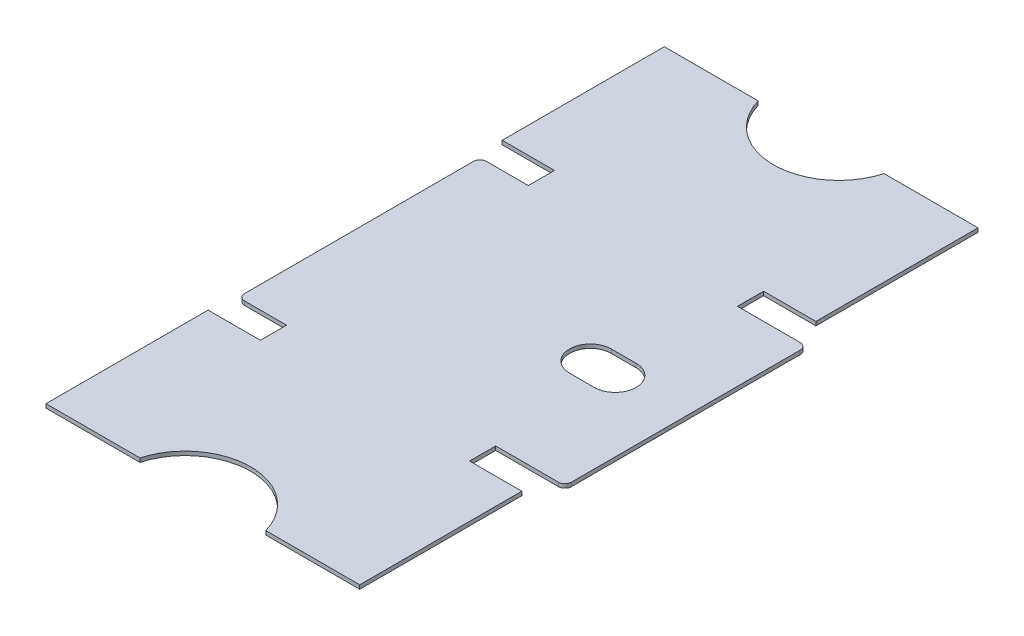
ISO-10303-21;
HEADER;
FILE_DESCRIPTION(('STEP AP214'),'2;1');
FILE_NAME('part.step','',(''),(''),'','','');
FILE_SCHEMA(('AUTOMOTIVE_DESIGN { 1 0 10303 214 1 1 1 1 }'));
ENDSEC;
DATA;
#1=APPLICATION_CONTEXT('core data for automotive mechanical design processes');
#2=APPLICATION_PROTOCOL_DEFINITION('international standard','automotive_design',2000,#1);
#3=PRODUCT_CONTEXT('',#1,'mechanical');
#4=PRODUCT('Part','Part','',(#3));
#5=PRODUCT_RELATED_PRODUCT_CATEGORY('part','',(#4));
#6=PRODUCT_DEFINITION_FORMATION('','',#4);
#7=PRODUCT_DEFINITION_CONTEXT('part definition',#1,'design');
#8=PRODUCT_DEFINITION('design','',#6,#7);
#9=PRODUCT_DEFINITION_SHAPE('','',#8);
#10=(LENGTH_UNIT() NAMED_UNIT(*) SI_UNIT(.MILLI.,.METRE.));
#11=(NAMED_UNIT(*) PLANE_ANGLE_UNIT() SI_UNIT($,.RADIAN.));
#12=(NAMED_UNIT(*) SI_UNIT($,.STERADIAN.) SOLID_ANGLE_UNIT());
#13=UNCERTAINTY_MEASURE_WITH_UNIT(LENGTH_MEASURE(1.E-05),#10,'distance_accuracy_value','');
#14=(GEOMETRIC_REPRESENTATION_CONTEXT(3) GLOBAL_UNCERTAINTY_ASSIGNED_CONTEXT((#13)) GLOBAL_UNIT_ASSIGNED_CONTEXT((#10,
#11,#12)) REPRESENTATION_CONTEXT('',''));
#15=CARTESIAN_POINT('',(0.,0.,0.));
#16=DIRECTION('',(0.,0.,1.));
#17=DIRECTION('',(1.,0.,0.));
#18=AXIS2_PLACEMENT_3D('',#15,#16,#17);
#19=CARTESIAN_POINT('',(-23.4045410586217,0.3,-30.1001557545187));
#20=DIRECTION('',(0.,1.,0.));
#21=DIRECTION('',(0.,0.,1.));
#22=AXIS2_PLACEMENT_3D('',#19,#20,#21);
#23=PLANE('',#22);
#24=DIRECTION('',(1.,0.,0.));
#25=VECTOR('',#24,1.);
#26=CARTESIAN_POINT('',(-15.4045410586217,0.3,-16.3501557545187));
#27=LINE('',#26,#25);
#28=CARTESIAN_POINT('',(-15.4045410586217,0.3,-16.3501557545187));
#29=VERTEX_POINT('',#28);
#30=CARTESIAN_POINT('',(-11.4045410586217,0.3,-16.3501557545187));
#31=VERTEX_POINT('',#30);
#32=EDGE_CURVE('E279',#29,#31,#27,.T.);
#33=ORIENTED_EDGE('',*,*,#32,.T.);
#34=DIRECTION('',(0.,0.,-1.));
#35=VECTOR('',#34,1.);
#36=CARTESIAN_POINT('',(-11.4045410586217,0.3,-16.3501557545187));
#37=LINE('',#36,#35);
#38=CARTESIAN_POINT('',(-11.4045410586217,0.3,-28.7501557545188));
#39=VERTEX_POINT('',#38);
#40=EDGE_CURVE('E282',#31,#39,#37,.T.);
#41=ORIENTED_EDGE('',*,*,#40,.T.);
#42=DIRECTION('',(-1.,0.,0.));
#43=VECTOR('',#42,1.);
#44=CARTESIAN_POINT('',(-11.4045410586217,0.3,-28.7501557545188));
#45=LINE('',#44,#43);
#46=CARTESIAN_POINT('',(-18.5902394477959,0.3,-28.7501557545188));
#47=VERTEX_POINT('',#46);
#48=EDGE_CURVE('E285',#39,#47,#45,.T.);
#49=ORIENTED_EDGE('',*,*,#48,.T.);
#50=CARTESIAN_POINT('',(-23.4045410586217,0.3,-30.1001557545187));
#51=DIRECTION('',(0.,-1.,0.));
#52=DIRECTION('',(0.,0.,1.));
#53=AXIS2_PLACEMENT_3D('',#50,#51,#52);
#54=CIRCLE('',#53,5.);
#55=CARTESIAN_POINT('',(-28.2188426694476,0.3,-28.7501557545188));
#56=VERTEX_POINT('',#55);
#57=EDGE_CURVE('E287',#47,#56,#54,.T.);
#58=ORIENTED_EDGE('',*,*,#57,.T.);
#59=DIRECTION('',(-1.,0.,0.));
#60=VECTOR('',#59,1.);
#61=CARTESIAN_POINT('',(-28.2188426694476,0.3,-28.7501557545188));
#62=LINE('',#61,#60);
#63=CARTESIAN_POINT('',(-35.4045410586217,0.3,-28.7501557545188));
#64=VERTEX_POINT('',#63);
#65=EDGE_CURVE('E289',#56,#64,#62,.T.);
#66=ORIENTED_EDGE('',*,*,#65,.T.);
#67=DIRECTION('',(0.,0.,1.));
#68=VECTOR('',#67,1.);
#69=CARTESIAN_POINT('',(-35.4045410586217,0.3,-28.7501557545188));
#70=LINE('',#69,#68);
#71=CARTESIAN_POINT('',(-35.4045410586217,0.3,-16.3501557545187));
#72=VERTEX_POINT('',#71);
#73=EDGE_CURVE('E291',#64,#72,#70,.T.);
#74=ORIENTED_EDGE('',*,*,#73,.T.);
#75=DIRECTION('',(1.,0.,0.));
#76=VECTOR('',#75,1.);
#77=CARTESIAN_POINT('',(-35.4045410586217,0.3,-16.3501557545187));
#78=LINE('',#77,#76);
#79=CARTESIAN_POINT('',(-31.4045410586218,0.3,-16.3501557545187));
#80=VERTEX_POINT('',#79);
#81=EDGE_CURVE('E293',#72,#80,#78,.T.);
#82=ORIENTED_EDGE('',*,*,#81,.T.);
#83=DIRECTION('',(0.,0.,1.));
#84=VECTOR('',#83,1.);
#85=CARTESIAN_POINT('',(-31.4045410586218,0.3,-16.3501557545187));
#86=LINE('',#85,#84);
#87=CARTESIAN_POINT('',(-31.4045410586218,0.3,-14.3501557545187));
#88=VERTEX_POINT('',#87);
#89=EDGE_CURVE('E295',#80,#88,#86,.T.);
#90=ORIENTED_EDGE('',*,*,#89,.T.);
#91=DIRECTION('',(-1.,0.,0.));
#92=VECTOR('',#91,1.);
#93=CARTESIAN_POINT('',(-31.4045410586218,0.3,-14.3501557545187));
#94=LINE('',#93,#92);
#95=CARTESIAN_POINT('',(-34.6045410586218,0.3,-14.3501557545187));
#96=VERTEX_POINT('',#95);
#97=EDGE_CURVE('E297',#88,#96,#94,.T.);
#98=ORIENTED_EDGE('',*,*,#97,.T.);
#99=CARTESIAN_POINT('',(-34.6045410586217,0.3,-13.8501557545187));
#100=DIRECTION('',(0.,1.,0.));
#101=DIRECTION('',(0.,0.,1.));
#102=AXIS2_PLACEMENT_3D('',#99,#100,#101);
#103=CIRCLE('',#102,0.5);
#104=CARTESIAN_POINT('',(-35.1045410586217,0.3,-13.8501557545187));
#105=VERTEX_POINT('',#104);
#106=EDGE_CURVE('E299',#96,#105,#103,.T.);
#107=ORIENTED_EDGE('',*,*,#106,.T.);
#108=DIRECTION('',(0.,0.,1.));
#109=VECTOR('',#108,1.);
#110=CARTESIAN_POINT('',(-35.1045410586217,0.3,-13.8501557545187));
#111=LINE('',#110,#109);
#112=CARTESIAN_POINT('',(-35.1045410586217,0.3,3.64984424548134));
#113=VERTEX_POINT('',#112);
#114=EDGE_CURVE('E301',#105,#113,#111,.T.);
#115=ORIENTED_EDGE('',*,*,#114,.T.);
#116=CARTESIAN_POINT('',(-34.6045410586217,0.3,3.64984424548133));
#117=DIRECTION('',(0.,1.,0.));
#118=DIRECTION('',(0.,0.,1.));
#119=AXIS2_PLACEMENT_3D('',#116,#117,#118);
#120=CIRCLE('',#119,0.5);
#121=CARTESIAN_POINT('',(-34.6045410586217,0.3,4.14984424548133));
#122=VERTEX_POINT('',#121);
#123=EDGE_CURVE('E303',#113,#122,#120,.T.);
#124=ORIENTED_EDGE('',*,*,#123,.T.);
#125=DIRECTION('',(1.,0.,0.));
#126=VECTOR('',#125,1.);
#127=CARTESIAN_POINT('',(-34.6045410586217,0.3,4.14984424548133));
#128=LINE('',#127,#126);
#129=CARTESIAN_POINT('',(-31.4045410586217,0.3,4.14984424548133));
#130=VERTEX_POINT('',#129);
#131=EDGE_CURVE('E305',#122,#130,#128,.T.);
#132=ORIENTED_EDGE('',*,*,#131,.T.);
#133=DIRECTION('',(0.,0.,1.));
#134=VECTOR('',#133,1.);
#135=CARTESIAN_POINT('',(-31.4045410586217,0.3,4.14984424548133));
#136=LINE('',#135,#134);
#137=CARTESIAN_POINT('',(-31.4045410586218,0.3,6.14984424548133));
#138=VERTEX_POINT('',#137);
#139=EDGE_CURVE('E307',#130,#138,#136,.T.);
#140=ORIENTED_EDGE('',*,*,#139,.T.);
#141=DIRECTION('',(-1.,0.,0.));
#142=VECTOR('',#141,1.);
#143=CARTESIAN_POINT('',(-31.4045410586218,0.3,6.14984424548133));
#144=LINE('',#143,#142);
#145=CARTESIAN_POINT('',(-35.4045410586217,0.3,6.14984424548133));
#146=VERTEX_POINT('',#145);
#147=EDGE_CURVE('E309',#138,#146,#144,.T.);
#148=ORIENTED_EDGE('',*,*,#147,.T.);
#149=DIRECTION('',(0.,0.,1.));
#150=VECTOR('',#149,1.);
#151=CARTESIAN_POINT('',(-35.4045410586217,0.3,6.14984424548133));
#152=LINE('',#151,#150);
#153=CARTESIAN_POINT('',(-35.4045410586217,0.3,18.5498442454815));
#154=VERTEX_POINT('',#153);
#155=EDGE_CURVE('E311',#146,#154,#152,.T.);
#156=ORIENTED_EDGE('',*,*,#155,.T.);
#157=DIRECTION('',(1.,0.,0.));
#158=VECTOR('',#157,1.);
#159=CARTESIAN_POINT('',(-35.4045410586217,0.3,18.5498442454815));
#160=LINE('',#159,#158);
#161=CARTESIAN_POINT('',(-28.2188426694476,0.3,18.5498442454815));
#162=VERTEX_POINT('',#161);
#163=EDGE_CURVE('E313',#154,#162,#160,.T.);
#164=ORIENTED_EDGE('',*,*,#163,.T.);
#165=CARTESIAN_POINT('',(-23.4045410586217,0.3,19.8998442454812));
#166=DIRECTION('',(0.,-1.,0.));
#167=DIRECTION('',(0.,0.,1.));
#168=AXIS2_PLACEMENT_3D('',#165,#166,#167);
#169=CIRCLE('',#168,5.);
#170=CARTESIAN_POINT('',(-18.5902394477958,0.3,18.5498442454815));
#171=VERTEX_POINT('',#170);
#172=EDGE_CURVE('E315',#162,#171,#169,.T.);
#173=ORIENTED_EDGE('',*,*,#172,.T.);
#174=DIRECTION('',(1.,0.,0.));
#175=VECTOR('',#174,1.);
#176=CARTESIAN_POINT('',(-18.5902394477958,0.3,18.5498442454815));
#177=LINE('',#176,#175);
#178=CARTESIAN_POINT('',(-11.4045410586217,0.3,18.5498442454815));
#179=VERTEX_POINT('',#178);
#180=EDGE_CURVE('E317',#171,#179,#177,.T.);
#181=ORIENTED_EDGE('',*,*,#180,.T.);
#182=DIRECTION('',(0.,0.,-1.));
#183=VECTOR('',#182,1.);
#184=CARTESIAN_POINT('',(-11.4045410586217,0.3,18.5498442454815));
#185=LINE('',#184,#183);
#186=CARTESIAN_POINT('',(-11.4045410586217,0.3,6.14984424548133));
#187=VERTEX_POINT('',#186);
#188=EDGE_CURVE('E319',#179,#187,#185,.T.);
#189=ORIENTED_EDGE('',*,*,#188,.T.);
#190=DIRECTION('',(-1.,0.,0.));
#191=VECTOR('',#190,1.);
#192=CARTESIAN_POINT('',(-11.4045410586217,0.3,6.14984424548133));
#193=LINE('',#192,#191);
#194=CARTESIAN_POINT('',(-15.4045410586217,0.3,6.14984424548133));
#195=VERTEX_POINT('',#194);
#196=EDGE_CURVE('E321',#187,#195,#193,.T.);
#197=ORIENTED_EDGE('',*,*,#196,.T.);
#198=DIRECTION('',(0.,0.,-1.));
#199=VECTOR('',#198,1.);
#200=CARTESIAN_POINT('',(-15.4045410586217,0.3,6.14984424548133));
#201=LINE('',#200,#199);
#202=CARTESIAN_POINT('',(-15.4045410586217,0.3,4.14984424548133));
#203=VERTEX_POINT('',#202);
#204=EDGE_CURVE('E323',#195,#203,#201,.T.);
#205=ORIENTED_EDGE('',*,*,#204,.T.);
#206=DIRECTION('',(1.,0.,0.));
#207=VECTOR('',#206,1.);
#208=CARTESIAN_POINT('',(-15.4045410586217,0.3,4.14984424548133));
#209=LINE('',#208,#207);
#210=CARTESIAN_POINT('',(-10.6045410586217,0.3,4.14984424548132));
#211=VERTEX_POINT('',#210);
#212=EDGE_CURVE('E325',#203,#211,#209,.T.);
#213=ORIENTED_EDGE('',*,*,#212,.T.);
#214=CARTESIAN_POINT('',(-10.6045410586217,0.3,3.64984424548133));
#215=DIRECTION('',(0.,1.,0.));
#216=DIRECTION('',(0.,0.,1.));
#217=AXIS2_PLACEMENT_3D('',#214,#215,#216);
#218=CIRCLE('',#217,0.499999999999999);
#219=CARTESIAN_POINT('',(-10.1045410586217,0.3,3.64984424548133));
#220=VERTEX_POINT('',#219);
#221=EDGE_CURVE('E327',#211,#220,#218,.T.);
#222=ORIENTED_EDGE('',*,*,#221,.T.);
#223=DIRECTION('',(0.,0.,-1.));
#224=VECTOR('',#223,1.);
#225=CARTESIAN_POINT('',(-10.1045410586217,0.3,3.64984424548133));
#226=LINE('',#225,#224);
#227=CARTESIAN_POINT('',(-10.1045410586217,0.3,-13.8501557545187));
#228=VERTEX_POINT('',#227);
#229=EDGE_CURVE('E329',#220,#228,#226,.T.);
#230=ORIENTED_EDGE('',*,*,#229,.T.);
#231=CARTESIAN_POINT('',(-10.6045410586217,0.3,-13.8501557545187));
#232=DIRECTION('',(0.,1.,0.));
#233=DIRECTION('',(0.,0.,1.));
#234=AXIS2_PLACEMENT_3D('',#231,#232,#233);
#235=CIRCLE('',#234,0.499999999999997);
#236=CARTESIAN_POINT('',(-10.6045410586218,0.3,-14.3501557545187));
#237=VERTEX_POINT('',#236);
#238=EDGE_CURVE('E331',#228,#237,#235,.T.);
#239=ORIENTED_EDGE('',*,*,#238,.T.);
#240=DIRECTION('',(-1.,0.,0.));
#241=VECTOR('',#240,1.);
#242=CARTESIAN_POINT('',(-10.6045410586218,0.3,-14.3501557545187));
#243=LINE('',#242,#241);
#244=CARTESIAN_POINT('',(-15.4045410586217,0.3,-14.3501557545187));
#245=VERTEX_POINT('',#244);
#246=EDGE_CURVE('E333',#237,#245,#243,.T.);
#247=ORIENTED_EDGE('',*,*,#246,.T.);
#248=DIRECTION('',(0.,0.,-1.));
#249=VECTOR('',#248,1.);
#250=CARTESIAN_POINT('',(-15.4045410586217,0.3,-14.3501557545187));
#251=LINE('',#250,#249);
#252=EDGE_CURVE('E335',#245,#29,#251,.T.);
#253=ORIENTED_EDGE('',*,*,#252,.T.);
#254=EDGE_LOOP('',(#33,#41,#49,#58,#66,#74,#82,#90,#98,#107,#115,#124,#132,#140,#148,#156,#164,
#173,#181,#189,#197,#205,#213,#222,#230,#239,#247,#253));
#255=FACE_BOUND('',#254,.T.);
#256=DIRECTION('',(1.,0.,0.));
#257=VECTOR('',#256,1.);
#258=CARTESIAN_POINT('',(-17.4045410586217,0.3,-3.50015575451867));
#259=LINE('',#258,#257);
#260=CARTESIAN_POINT('',(-17.4045410586217,0.3,-3.50015575451867));
#261=VERTEX_POINT('',#260);
#262=CARTESIAN_POINT('',(-15.5045410586217,0.3,-3.50015575451867));
#263=VERTEX_POINT('',#262);
#264=EDGE_CURVE('E251',#261,#263,#259,.T.);
#265=ORIENTED_EDGE('',*,*,#264,.F.);
#266=CARTESIAN_POINT('',(-17.4045410586217,0.3,-5.10015575451868));
#267=DIRECTION('',(0.,1.,0.));
#268=DIRECTION('',(0.,0.,1.));
#269=AXIS2_PLACEMENT_3D('',#266,#267,#268);
#270=CIRCLE('',#269,1.6);
#271=CARTESIAN_POINT('',(-17.4045410586217,0.3,-6.70015575451868));
#272=VERTEX_POINT('',#271);
#273=EDGE_CURVE('E243',#272,#261,#270,.T.);
#274=ORIENTED_EDGE('',*,*,#273,.F.);
#275=DIRECTION('',(-1.,0.,0.));
#276=VECTOR('',#275,1.);
#277=CARTESIAN_POINT('',(-17.4045410586217,0.3,-6.70015575451868));
#278=LINE('',#277,#276);
#279=CARTESIAN_POINT('',(-15.5045410586217,0.3,-6.70015575451868));
#280=VERTEX_POINT('',#279);
#281=EDGE_CURVE('E265',#280,#272,#278,.T.);
#282=ORIENTED_EDGE('',*,*,#281,.F.);
#283=CARTESIAN_POINT('',(-15.5045410586217,0.3,-5.10015575451868));
#284=DIRECTION('',(0.,1.,0.));
#285=DIRECTION('',(0.,0.,1.));
#286=AXIS2_PLACEMENT_3D('',#283,#284,#285);
#287=CIRCLE('',#286,1.6);
#288=EDGE_CURVE('E263',#263,#280,#287,.T.);
#289=ORIENTED_EDGE('',*,*,#288,.F.);
#290=EDGE_LOOP('',(#265,#274,#282,#289));
#291=FACE_BOUND('',#290,.T.);
#292=ADVANCED_FACE('F34',(#255,#291),#23,.T.);
#293=CARTESIAN_POINT('',(-23.4045410586217,0.,-30.1001557545187));
#294=DIRECTION('',(0.,1.,0.));
#295=DIRECTION('',(0.,0.,1.));
#296=AXIS2_PLACEMENT_3D('',#293,#294,#295);
#297=PLANE('',#296);
#298=DIRECTION('',(1.,0.,0.));
#299=VECTOR('',#298,1.);
#300=CARTESIAN_POINT('',(-15.4045410586217,0.,-16.3501557545187));
#301=LINE('',#300,#299);
#302=CARTESIAN_POINT('',(-15.4045410586217,0.,-16.3501557545187));
#303=VERTEX_POINT('',#302);
#304=CARTESIAN_POINT('',(-11.4045410586217,0.,-16.3501557545187));
#305=VERTEX_POINT('',#304);
#306=EDGE_CURVE('E259',#303,#305,#301,.T.);
#307=ORIENTED_EDGE('',*,*,#306,.F.);
#308=DIRECTION('',(0.,0.,-1.));
#309=VECTOR('',#308,1.);
#310=CARTESIAN_POINT('',(-15.4045410586217,0.,-14.3501557545187));
#311=LINE('',#310,#309);
#312=CARTESIAN_POINT('',(-15.4045410586217,0.,-14.3501557545187));
#313=VERTEX_POINT('',#312);
#314=EDGE_CURVE('E283',#313,#303,#311,.T.);
#315=ORIENTED_EDGE('',*,*,#314,.F.);
#316=DIRECTION('',(-1.,0.,0.));
#317=VECTOR('',#316,1.);
#318=CARTESIAN_POINT('',(-10.6045410586218,0.,-14.3501557545187));
#319=LINE('',#318,#317);
#320=CARTESIAN_POINT('',(-10.6045410586218,0.,-14.3501557545187));
#321=VERTEX_POINT('',#320);
#322=EDGE_CURVE('E390',#321,#313,#319,.T.);
#323=ORIENTED_EDGE('',*,*,#322,.F.);
#324=CARTESIAN_POINT('',(-10.6045410586217,0.,-13.8501557545187));
#325=DIRECTION('',(0.,1.,0.));
#326=DIRECTION('',(0.,0.,1.));
#327=AXIS2_PLACEMENT_3D('',#324,#325,#326);
#328=CIRCLE('',#327,0.499999999999997);
#329=CARTESIAN_POINT('',(-10.1045410586217,0.,-13.8501557545187));
#330=VERTEX_POINT('',#329);
#331=EDGE_CURVE('E388',#330,#321,#328,.T.);
#332=ORIENTED_EDGE('',*,*,#331,.F.);
#333=DIRECTION('',(0.,0.,-1.));
#334=VECTOR('',#333,1.);
#335=CARTESIAN_POINT('',(-10.1045410586217,0.,3.64984424548133));
#336=LINE('',#335,#334);
#337=CARTESIAN_POINT('',(-10.1045410586217,0.,3.64984424548133));
#338=VERTEX_POINT('',#337);
#339=EDGE_CURVE('E386',#338,#330,#336,.T.);
#340=ORIENTED_EDGE('',*,*,#339,.F.);
#341=CARTESIAN_POINT('',(-10.6045410586217,0.,3.64984424548133));
#342=DIRECTION('',(0.,1.,0.));
#343=DIRECTION('',(0.,0.,1.));
#344=AXIS2_PLACEMENT_3D('',#341,#342,#343);
#345=CIRCLE('',#344,0.499999999999999);
#346=CARTESIAN_POINT('',(-10.6045410586217,0.,4.14984424548132));
#347=VERTEX_POINT('',#346);
#348=EDGE_CURVE('E384',#347,#338,#345,.T.);
#349=ORIENTED_EDGE('',*,*,#348,.F.);
#350=DIRECTION('',(1.,0.,0.));
#351=VECTOR('',#350,1.);
#352=CARTESIAN_POINT('',(-15.4045410586217,0.,4.14984424548133));
#353=LINE('',#352,#351);
#354=CARTESIAN_POINT('',(-15.4045410586217,0.,4.14984424548133));
#355=VERTEX_POINT('',#354);
#356=EDGE_CURVE('E382',#355,#347,#353,.T.);
#357=ORIENTED_EDGE('',*,*,#356,.F.);
#358=DIRECTION('',(0.,0.,-1.));
#359=VECTOR('',#358,1.);
#360=CARTESIAN_POINT('',(-15.4045410586217,0.,6.14984424548133));
#361=LINE('',#360,#359);
#362=CARTESIAN_POINT('',(-15.4045410586217,0.,6.14984424548133));
#363=VERTEX_POINT('',#362);
#364=EDGE_CURVE('E380',#363,#355,#361,.T.);
#365=ORIENTED_EDGE('',*,*,#364,.F.);
#366=DIRECTION('',(-1.,0.,0.));
#367=VECTOR('',#366,1.);
#368=CARTESIAN_POINT('',(-11.4045410586217,0.,6.14984424548133));
#369=LINE('',#368,#367);
#370=CARTESIAN_POINT('',(-11.4045410586217,0.,6.14984424548133));
#371=VERTEX_POINT('',#370);
#372=EDGE_CURVE('E378',#371,#363,#369,.T.);
#373=ORIENTED_EDGE('',*,*,#372,.F.);
#374=DIRECTION('',(0.,0.,-1.));
#375=VECTOR('',#374,1.);
#376=CARTESIAN_POINT('',(-11.4045410586217,0.,18.5498442454815));
#377=LINE('',#376,#375);
#378=CARTESIAN_POINT('',(-11.4045410586217,0.,18.5498442454815));
#379=VERTEX_POINT('',#378);
#380=EDGE_CURVE('E376',#379,#371,#377,.T.);
#381=ORIENTED_EDGE('',*,*,#380,.F.);
#382=DIRECTION('',(1.,0.,0.));
#383=VECTOR('',#382,1.);
#384=CARTESIAN_POINT('',(-18.5902394477958,0.,18.5498442454815));
#385=LINE('',#384,#383);
#386=CARTESIAN_POINT('',(-18.5902394477958,0.,18.5498442454815));
#387=VERTEX_POINT('',#386);
#388=EDGE_CURVE('E374',#387,#379,#385,.T.);
#389=ORIENTED_EDGE('',*,*,#388,.F.);
#390=CARTESIAN_POINT('',(-23.4045410586217,0.,19.8998442454812));
#391=DIRECTION('',(0.,-1.,0.));
#392=DIRECTION('',(0.,0.,1.));
#393=AXIS2_PLACEMENT_3D('',#390,#391,#392);
#394=CIRCLE('',#393,5.);
#395=CARTESIAN_POINT('',(-28.2188426694476,0.,18.5498442454815));
#396=VERTEX_POINT('',#395);
#397=EDGE_CURVE('E372',#396,#387,#394,.T.);
#398=ORIENTED_EDGE('',*,*,#397,.F.);
#399=DIRECTION('',(1.,0.,0.));
#400=VECTOR('',#399,1.);
#401=CARTESIAN_POINT('',(-35.4045410586217,0.,18.5498442454815));
#402=LINE('',#401,#400);
#403=CARTESIAN_POINT('',(-35.4045410586217,0.,18.5498442454815));
#404=VERTEX_POINT('',#403);
#405=EDGE_CURVE('E370',#404,#396,#402,.T.);
#406=ORIENTED_EDGE('',*,*,#405,.F.);
#407=DIRECTION('',(0.,0.,1.));
#408=VECTOR('',#407,1.);
#409=CARTESIAN_POINT('',(-35.4045410586217,0.,6.14984424548133));
#410=LINE('',#409,#408);
#411=CARTESIAN_POINT('',(-35.4045410586217,0.,6.14984424548133));
#412=VERTEX_POINT('',#411);
#413=EDGE_CURVE('E368',#412,#404,#410,.T.);
#414=ORIENTED_EDGE('',*,*,#413,.F.);
#415=DIRECTION('',(-1.,0.,0.));
#416=VECTOR('',#415,1.);
#417=CARTESIAN_POINT('',(-31.4045410586218,0.,6.14984424548133));
#418=LINE('',#417,#416);
#419=CARTESIAN_POINT('',(-31.4045410586218,0.,6.14984424548133));
#420=VERTEX_POINT('',#419);
#421=EDGE_CURVE('E366',#420,#412,#418,.T.);
#422=ORIENTED_EDGE('',*,*,#421,.F.);
#423=DIRECTION('',(0.,0.,1.));
#424=VECTOR('',#423,1.);
#425=CARTESIAN_POINT('',(-31.4045410586217,0.,4.14984424548133));
#426=LINE('',#425,#424);
#427=CARTESIAN_POINT('',(-31.4045410586217,0.,4.14984424548133));
#428=VERTEX_POINT('',#427);
#429=EDGE_CURVE('E364',#428,#420,#426,.T.);
#430=ORIENTED_EDGE('',*,*,#429,.F.);
#431=DIRECTION('',(1.,0.,0.));
#432=VECTOR('',#431,1.);
#433=CARTESIAN_POINT('',(-34.6045410586217,0.,4.14984424548133));
#434=LINE('',#433,#432);
#435=CARTESIAN_POINT('',(-34.6045410586217,0.,4.14984424548133));
#436=VERTEX_POINT('',#435);
#437=EDGE_CURVE('E362',#436,#428,#434,.T.);
#438=ORIENTED_EDGE('',*,*,#437,.F.);
#439=CARTESIAN_POINT('',(-34.6045410586217,0.,3.64984424548133));
#440=DIRECTION('',(0.,1.,0.));
#441=DIRECTION('',(0.,0.,1.));
#442=AXIS2_PLACEMENT_3D('',#439,#440,#441);
#443=CIRCLE('',#442,0.5);
#444=CARTESIAN_POINT('',(-35.1045410586217,0.,3.64984424548134));
#445=VERTEX_POINT('',#444);
#446=EDGE_CURVE('E360',#445,#436,#443,.T.);
#447=ORIENTED_EDGE('',*,*,#446,.F.);
#448=DIRECTION('',(0.,0.,1.));
#449=VECTOR('',#448,1.);
#450=CARTESIAN_POINT('',(-35.1045410586217,0.,-13.8501557545187));
#451=LINE('',#450,#449);
#452=CARTESIAN_POINT('',(-35.1045410586217,0.,-13.8501557545187));
#453=VERTEX_POINT('',#452);
#454=EDGE_CURVE('E358',#453,#445,#451,.T.);
#455=ORIENTED_EDGE('',*,*,#454,.F.);
#456=CARTESIAN_POINT('',(-34.6045410586217,0.,-13.8501557545187));
#457=DIRECTION('',(0.,1.,0.));
#458=DIRECTION('',(0.,0.,1.));
#459=AXIS2_PLACEMENT_3D('',#456,#457,#458);
#460=CIRCLE('',#459,0.5);
#461=CARTESIAN_POINT('',(-34.6045410586218,0.,-14.3501557545187));
#462=VERTEX_POINT('',#461);
#463=EDGE_CURVE('E356',#462,#453,#460,.T.);
#464=ORIENTED_EDGE('',*,*,#463,.F.);
#465=DIRECTION('',(-1.,0.,0.));
#466=VECTOR('',#465,1.);
#467=CARTESIAN_POINT('',(-31.4045410586218,0.,-14.3501557545187));
#468=LINE('',#467,#466);
#469=CARTESIAN_POINT('',(-31.4045410586218,0.,-14.3501557545187));
#470=VERTEX_POINT('',#469);
#471=EDGE_CURVE('E354',#470,#462,#468,.T.);
#472=ORIENTED_EDGE('',*,*,#471,.F.);
#473=DIRECTION('',(0.,0.,1.));
#474=VECTOR('',#473,1.);
#475=CARTESIAN_POINT('',(-31.4045410586218,0.,-16.3501557545187));
#476=LINE('',#475,#474);
#477=CARTESIAN_POINT('',(-31.4045410586218,0.,-16.3501557545187));
#478=VERTEX_POINT('',#477);
#479=EDGE_CURVE('E352',#478,#470,#476,.T.);
#480=ORIENTED_EDGE('',*,*,#479,.F.);
#481=DIRECTION('',(1.,0.,0.));
#482=VECTOR('',#481,1.);
#483=CARTESIAN_POINT('',(-35.4045410586217,0.,-16.3501557545187));
#484=LINE('',#483,#482);
#485=CARTESIAN_POINT('',(-35.4045410586217,0.,-16.3501557545187));
#486=VERTEX_POINT('',#485);
#487=EDGE_CURVE('E350',#486,#478,#484,.T.);
#488=ORIENTED_EDGE('',*,*,#487,.F.);
#489=DIRECTION('',(0.,0.,1.));
#490=VECTOR('',#489,1.);
#491=CARTESIAN_POINT('',(-35.4045410586217,0.,-28.7501557545188));
#492=LINE('',#491,#490);
#493=CARTESIAN_POINT('',(-35.4045410586217,0.,-28.7501557545188));
#494=VERTEX_POINT('',#493);
#495=EDGE_CURVE('E348',#494,#486,#492,.T.);
#496=ORIENTED_EDGE('',*,*,#495,.F.);
#497=DIRECTION('',(-1.,0.,0.));
#498=VECTOR('',#497,1.);
#499=CARTESIAN_POINT('',(-28.2188426694476,0.,-28.7501557545188));
#500=LINE('',#499,#498);
#501=CARTESIAN_POINT('',(-28.2188426694476,0.,-28.7501557545188));
#502=VERTEX_POINT('',#501);
#503=EDGE_CURVE('E346',#502,#494,#500,.T.);
#504=ORIENTED_EDGE('',*,*,#503,.F.);
#505=CARTESIAN_POINT('',(-23.4045410586217,0.,-30.1001557545187));
#506=DIRECTION('',(0.,-1.,0.));
#507=DIRECTION('',(0.,0.,1.));
#508=AXIS2_PLACEMENT_3D('',#505,#506,#507);
#509=CIRCLE('',#508,5.);
#510=CARTESIAN_POINT('',(-18.5902394477959,0.,-28.7501557545188));
#511=VERTEX_POINT('',#510);
#512=EDGE_CURVE('E344',#511,#502,#509,.T.);
#513=ORIENTED_EDGE('',*,*,#512,.F.);
#514=DIRECTION('',(-1.,0.,0.));
#515=VECTOR('',#514,1.);
#516=CARTESIAN_POINT('',(-11.4045410586217,0.,-28.7501557545188));
#517=LINE('',#516,#515);
#518=CARTESIAN_POINT('',(-11.4045410586217,0.,-28.7501557545188));
#519=VERTEX_POINT('',#518);
#520=EDGE_CURVE('E342',#519,#511,#517,.T.);
#521=ORIENTED_EDGE('',*,*,#520,.F.);
#522=DIRECTION('',(0.,0.,-1.));
#523=VECTOR('',#522,1.);
#524=CARTESIAN_POINT('',(-11.4045410586217,0.,-16.3501557545187));
#525=LINE('',#524,#523);
#526=EDGE_CURVE('E340',#305,#519,#525,.T.);
#527=ORIENTED_EDGE('',*,*,#526,.F.);
#528=EDGE_LOOP('',(#307,#315,#323,#332,#340,#349,#357,#365,#373,#381,#389,#398,#406,#414,#422,
#430,#438,#447,#455,#464,#472,#480,#488,#496,#504,#513,#521,#527));
#529=FACE_BOUND('',#528,.T.);
#530=CARTESIAN_POINT('',(-17.4045410586217,0.,-5.10015575451868));
#531=DIRECTION('',(0.,1.,0.));
#532=DIRECTION('',(0.,0.,1.));
#533=AXIS2_PLACEMENT_3D('',#530,#531,#532);
#534=CIRCLE('',#533,1.6);
#535=CARTESIAN_POINT('',(-17.4045410586217,0.,-6.70015575451868));
#536=VERTEX_POINT('',#535);
#537=CARTESIAN_POINT('',(-17.4045410586217,0.,-3.50015575451867));
#538=VERTEX_POINT('',#537);
#539=EDGE_CURVE('E57',#536,#538,#534,.T.);
#540=ORIENTED_EDGE('',*,*,#539,.T.);
#541=DIRECTION('',(1.,0.,0.));
#542=VECTOR('',#541,1.);
#543=CARTESIAN_POINT('',(-17.4045410586217,0.,-3.50015575451867));
#544=LINE('',#543,#542);
#545=CARTESIAN_POINT('',(-15.5045410586217,0.,-3.50015575451867));
#546=VERTEX_POINT('',#545);
#547=EDGE_CURVE('E258',#538,#546,#544,.T.);
#548=ORIENTED_EDGE('',*,*,#547,.T.);
#549=CARTESIAN_POINT('',(-15.5045410586217,0.,-5.10015575451868));
#550=DIRECTION('',(0.,1.,0.));
#551=DIRECTION('',(0.,0.,1.));
#552=AXIS2_PLACEMENT_3D('',#549,#550,#551);
#553=CIRCLE('',#552,1.6);
#554=CARTESIAN_POINT('',(-15.5045410586217,0.,-6.70015575451868));
#555=VERTEX_POINT('',#554);
#556=EDGE_CURVE('E271',#546,#555,#553,.T.);
#557=ORIENTED_EDGE('',*,*,#556,.T.);
#558=DIRECTION('',(-1.,0.,0.));
#559=VECTOR('',#558,1.);
#560=CARTESIAN_POINT('',(-17.4045410586217,0.,-6.70015575451868));
#561=LINE('',#560,#559);
#562=EDGE_CURVE('E252',#555,#536,#561,.T.);
#563=ORIENTED_EDGE('',*,*,#562,.T.);
#564=EDGE_LOOP('',(#540,#548,#557,#563));
#565=FACE_BOUND('',#564,.T.);
#566=ADVANCED_FACE('F480',(#529,#565),#297,.F.);
#567=CARTESIAN_POINT('',(-15.4045410586217,0.3,-16.3501557545187));
#568=DIRECTION('',(0.,0.,-1.));
#569=DIRECTION('',(-1.,0.,0.));
#570=AXIS2_PLACEMENT_3D('',#567,#568,#569);
#571=PLANE('',#570);
#572=ORIENTED_EDGE('',*,*,#306,.T.);
#573=DIRECTION('',(0.,-1.,0.));
#574=VECTOR('',#573,1.);
#575=CARTESIAN_POINT('',(-11.4045410586217,0.3,-16.3501557545187));
#576=LINE('',#575,#574);
#577=EDGE_CURVE('E11',#31,#305,#576,.T.);
#578=ORIENTED_EDGE('',*,*,#577,.F.);
#579=ORIENTED_EDGE('',*,*,#32,.F.);
#580=DIRECTION('',(0.,-1.,0.));
#581=VECTOR('',#580,1.);
#582=CARTESIAN_POINT('',(-15.4045410586217,0.3,-16.3501557545187));
#583=LINE('',#582,#581);
#584=EDGE_CURVE('E337',#29,#303,#583,.T.);
#585=ORIENTED_EDGE('',*,*,#584,.T.);
#586=EDGE_LOOP('',(#572,#578,#579,#585));
#587=FACE_BOUND('',#586,.T.);
#588=ADVANCED_FACE('F36',(#587),#571,.F.);
#589=CARTESIAN_POINT('',(-11.4045410586217,0.3,-16.3501557545187));
#590=DIRECTION('',(-1.,0.,0.));
#591=DIRECTION('',(0.,0.,1.));
#592=AXIS2_PLACEMENT_3D('',#589,#590,#591);
#593=PLANE('',#592);
#594=ORIENTED_EDGE('',*,*,#526,.T.);
#595=DIRECTION('',(0.,-1.,0.));
#596=VECTOR('',#595,1.);
#597=CARTESIAN_POINT('',(-11.4045410586217,0.3,-28.7501557545188));
#598=LINE('',#597,#596);
#599=EDGE_CURVE('E42',#39,#519,#598,.T.);
#600=ORIENTED_EDGE('',*,*,#599,.F.);
#601=ORIENTED_EDGE('',*,*,#40,.F.);
#602=ORIENTED_EDGE('',*,*,#577,.T.);
#603=EDGE_LOOP('',(#594,#600,#601,#602));
#604=FACE_BOUND('',#603,.T.);
#605=ADVANCED_FACE('F497',(#604),#593,.F.);
#606=CARTESIAN_POINT('',(-11.4045410586217,0.3,-28.7501557545188));
#607=DIRECTION('',(0.,0.,1.));
#608=DIRECTION('',(1.,0.,0.));
#609=AXIS2_PLACEMENT_3D('',#606,#607,#608);
#610=PLANE('',#609);
#611=ORIENTED_EDGE('',*,*,#520,.T.);
#612=DIRECTION('',(0.,-1.,0.));
#613=VECTOR('',#612,1.);
#614=CARTESIAN_POINT('',(-18.5902394477959,0.3,-28.7501557545188));
#615=LINE('',#614,#613);
#616=EDGE_CURVE('E467',#47,#511,#615,.T.);
#617=ORIENTED_EDGE('',*,*,#616,.F.);
#618=ORIENTED_EDGE('',*,*,#48,.F.);
#619=ORIENTED_EDGE('',*,*,#599,.T.);
#620=EDGE_LOOP('',(#611,#617,#618,#619));
#621=FACE_BOUND('',#620,.T.);
#622=ADVANCED_FACE('F474',(#621),#610,.F.);
#623=CARTESIAN_POINT('',(-23.4045410586217,0.3,-30.1001557545187));
#624=DIRECTION('',(0.,-1.,0.));
#625=DIRECTION('',(0.,0.,-1.));
#626=AXIS2_PLACEMENT_3D('',#623,#624,#625);
#627=CYLINDRICAL_SURFACE('',#626,5.);
#628=ORIENTED_EDGE('',*,*,#512,.T.);
#629=DIRECTION('',(0.,-1.,0.));
#630=VECTOR('',#629,1.);
#631=CARTESIAN_POINT('',(-28.2188426694476,0.3,-28.7501557545188));
#632=LINE('',#631,#630);
#633=EDGE_CURVE('E464',#56,#502,#632,.T.);
#634=ORIENTED_EDGE('',*,*,#633,.F.);
#635=ORIENTED_EDGE('',*,*,#57,.F.);
#636=ORIENTED_EDGE('',*,*,#616,.T.);
#637=EDGE_LOOP('',(#628,#634,#635,#636));
#638=FACE_BOUND('',#637,.T.);
#639=ADVANCED_FACE('F486',(#638),#627,.F.);
#640=CARTESIAN_POINT('',(-28.2188426694476,0.3,-28.7501557545188));
#641=DIRECTION('',(0.,0.,1.));
#642=DIRECTION('',(1.,0.,0.));
#643=AXIS2_PLACEMENT_3D('',#640,#641,#642);
#644=PLANE('',#643);
#645=ORIENTED_EDGE('',*,*,#503,.T.);
#646=DIRECTION('',(0.,-1.,0.));
#647=VECTOR('',#646,1.);
#648=CARTESIAN_POINT('',(-35.4045410586217,0.3,-28.7501557545188));
#649=LINE('',#648,#647);
#650=EDGE_CURVE('E461',#64,#494,#649,.T.);
#651=ORIENTED_EDGE('',*,*,#650,.F.);
#652=ORIENTED_EDGE('',*,*,#65,.F.);
#653=ORIENTED_EDGE('',*,*,#633,.T.);
#654=EDGE_LOOP('',(#645,#651,#652,#653));
#655=FACE_BOUND('',#654,.T.);
#656=ADVANCED_FACE('F490',(#655),#644,.F.);
#657=CARTESIAN_POINT('',(-35.4045410586217,0.3,-28.7501557545188));
#658=DIRECTION('',(1.,0.,0.));
#659=DIRECTION('',(0.,0.,-1.));
#660=AXIS2_PLACEMENT_3D('',#657,#658,#659);
#661=PLANE('',#660);
#662=ORIENTED_EDGE('',*,*,#495,.T.);
#663=DIRECTION('',(0.,-1.,0.));
#664=VECTOR('',#663,1.);
#665=CARTESIAN_POINT('',(-35.4045410586217,0.3,-16.3501557545187));
#666=LINE('',#665,#664);
#667=EDGE_CURVE('E458',#72,#486,#666,.T.);
#668=ORIENTED_EDGE('',*,*,#667,.F.);
#669=ORIENTED_EDGE('',*,*,#73,.F.);
#670=ORIENTED_EDGE('',*,*,#650,.T.);
#671=EDGE_LOOP('',(#662,#668,#669,#670));
#672=FACE_BOUND('',#671,.T.);
#673=ADVANCED_FACE('F610',(#672),#661,.F.);
#674=CARTESIAN_POINT('',(-35.4045410586217,0.3,-16.3501557545187));
#675=DIRECTION('',(0.,0.,-1.));
#676=DIRECTION('',(-1.,0.,0.));
#677=AXIS2_PLACEMENT_3D('',#674,#675,#676);
#678=PLANE('',#677);
#679=ORIENTED_EDGE('',*,*,#487,.T.);
#680=DIRECTION('',(0.,-1.,0.));
#681=VECTOR('',#680,1.);
#682=CARTESIAN_POINT('',(-31.4045410586218,0.3,-16.3501557545187));
#683=LINE('',#682,#681);
#684=EDGE_CURVE('E455',#80,#478,#683,.T.);
#685=ORIENTED_EDGE('',*,*,#684,.F.);
#686=ORIENTED_EDGE('',*,*,#81,.F.);
#687=ORIENTED_EDGE('',*,*,#667,.T.);
#688=EDGE_LOOP('',(#679,#685,#686,#687));
#689=FACE_BOUND('',#688,.T.);
#690=ADVANCED_FACE('F607',(#689),#678,.F.);
#691=CARTESIAN_POINT('',(-31.4045410586218,0.3,-16.3501557545187));
#692=DIRECTION('',(1.,0.,0.));
#693=DIRECTION('',(0.,0.,-1.));
#694=AXIS2_PLACEMENT_3D('',#691,#692,#693);
#695=PLANE('',#694);
#696=ORIENTED_EDGE('',*,*,#479,.T.);
#697=DIRECTION('',(0.,-1.,0.));
#698=VECTOR('',#697,1.);
#699=CARTESIAN_POINT('',(-31.4045410586218,0.3,-14.3501557545187));
#700=LINE('',#699,#698);
#701=EDGE_CURVE('E452',#88,#470,#700,.T.);
#702=ORIENTED_EDGE('',*,*,#701,.F.);
#703=ORIENTED_EDGE('',*,*,#89,.F.);
#704=ORIENTED_EDGE('',*,*,#684,.T.);
#705=EDGE_LOOP('',(#696,#702,#703,#704));
#706=FACE_BOUND('',#705,.T.);
#707=ADVANCED_FACE('F603',(#706),#695,.F.);
#708=CARTESIAN_POINT('',(-31.4045410586218,0.3,-14.3501557545187));
#709=DIRECTION('',(0.,0.,1.));
#710=DIRECTION('',(1.,0.,0.));
#711=AXIS2_PLACEMENT_3D('',#708,#709,#710);
#712=PLANE('',#711);
#713=ORIENTED_EDGE('',*,*,#471,.T.);
#714=DIRECTION('',(0.,-1.,0.));
#715=VECTOR('',#714,1.);
#716=CARTESIAN_POINT('',(-34.6045410586218,0.3,-14.3501557545187));
#717=LINE('',#716,#715);
#718=EDGE_CURVE('E449',#96,#462,#717,.T.);
#719=ORIENTED_EDGE('',*,*,#718,.F.);
#720=ORIENTED_EDGE('',*,*,#97,.F.);
#721=ORIENTED_EDGE('',*,*,#701,.T.);
#722=EDGE_LOOP('',(#713,#719,#720,#721));
#723=FACE_BOUND('',#722,.T.);
#724=ADVANCED_FACE('F599',(#723),#712,.F.);
#725=CARTESIAN_POINT('',(-34.6045410586217,0.3,-13.8501557545187));
#726=DIRECTION('',(0.,-1.,0.));
#727=DIRECTION('',(0.,0.,-1.));
#728=AXIS2_PLACEMENT_3D('',#725,#726,#727);
#729=CYLINDRICAL_SURFACE('',#728,0.5);
#730=ORIENTED_EDGE('',*,*,#463,.T.);
#731=DIRECTION('',(0.,-1.,0.));
#732=VECTOR('',#731,1.);
#733=CARTESIAN_POINT('',(-35.1045410586217,0.3,-13.8501557545187));
#734=LINE('',#733,#732);
#735=EDGE_CURVE('E446',#105,#453,#734,.T.);
#736=ORIENTED_EDGE('',*,*,#735,.F.);
#737=ORIENTED_EDGE('',*,*,#106,.F.);
#738=ORIENTED_EDGE('',*,*,#718,.T.);
#739=EDGE_LOOP('',(#730,#736,#737,#738));
#740=FACE_BOUND('',#739,.T.);
#741=ADVANCED_FACE('F594',(#740),#729,.T.);
#742=CARTESIAN_POINT('',(-35.1045410586217,0.3,-13.8501557545187));
#743=DIRECTION('',(1.,0.,0.));
#744=DIRECTION('',(0.,0.,-1.));
#745=AXIS2_PLACEMENT_3D('',#742,#743,#744);
#746=PLANE('',#745);
#747=ORIENTED_EDGE('',*,*,#454,.T.);
#748=DIRECTION('',(0.,-1.,0.));
#749=VECTOR('',#748,1.);
#750=CARTESIAN_POINT('',(-35.1045410586217,0.3,3.64984424548134));
#751=LINE('',#750,#749);
#752=EDGE_CURVE('E443',#113,#445,#751,.T.);
#753=ORIENTED_EDGE('',*,*,#752,.F.);
#754=ORIENTED_EDGE('',*,*,#114,.F.);
#755=ORIENTED_EDGE('',*,*,#735,.T.);
#756=EDGE_LOOP('',(#747,#753,#754,#755));
#757=FACE_BOUND('',#756,.T.);
#758=ADVANCED_FACE('F588',(#757),#746,.F.);
#759=CARTESIAN_POINT('',(-34.6045410586217,0.3,3.64984424548133));
#760=DIRECTION('',(0.,-1.,0.));
#761=DIRECTION('',(0.,0.,-1.));
#762=AXIS2_PLACEMENT_3D('',#759,#760,#761);
#763=CYLINDRICAL_SURFACE('',#762,0.5);
#764=ORIENTED_EDGE('',*,*,#446,.T.);
#765=DIRECTION('',(0.,-1.,0.));
#766=VECTOR('',#765,1.);
#767=CARTESIAN_POINT('',(-34.6045410586217,0.3,4.14984424548133));
#768=LINE('',#767,#766);
#769=EDGE_CURVE('E440',#122,#436,#768,.T.);
#770=ORIENTED_EDGE('',*,*,#769,.F.);
#771=ORIENTED_EDGE('',*,*,#123,.F.);
#772=ORIENTED_EDGE('',*,*,#752,.T.);
#773=EDGE_LOOP('',(#764,#770,#771,#772));
#774=FACE_BOUND('',#773,.T.);
#775=ADVANCED_FACE('F584',(#774),#763,.T.);
#776=CARTESIAN_POINT('',(-34.6045410586217,0.3,4.14984424548133));
#777=DIRECTION('',(0.,0.,-1.));
#778=DIRECTION('',(-1.,0.,0.));
#779=AXIS2_PLACEMENT_3D('',#776,#777,#778);
#780=PLANE('',#779);
#781=ORIENTED_EDGE('',*,*,#437,.T.);
#782=DIRECTION('',(0.,-1.,0.));
#783=VECTOR('',#782,1.);
#784=CARTESIAN_POINT('',(-31.4045410586217,0.3,4.14984424548133));
#785=LINE('',#784,#783);
#786=EDGE_CURVE('E437',#130,#428,#785,.T.);
#787=ORIENTED_EDGE('',*,*,#786,.F.);
#788=ORIENTED_EDGE('',*,*,#131,.F.);
#789=ORIENTED_EDGE('',*,*,#769,.T.);
#790=EDGE_LOOP('',(#781,#787,#788,#789));
#791=FACE_BOUND('',#790,.T.);
#792=ADVANCED_FACE('F579',(#791),#780,.F.);
#793=CARTESIAN_POINT('',(-31.4045410586217,0.3,4.14984424548133));
#794=DIRECTION('',(1.,0.,0.));
#795=DIRECTION('',(0.,0.,-1.));
#796=AXIS2_PLACEMENT_3D('',#793,#794,#795);
#797=PLANE('',#796);
#798=ORIENTED_EDGE('',*,*,#429,.T.);
#799=DIRECTION('',(0.,-1.,0.));
#800=VECTOR('',#799,1.);
#801=CARTESIAN_POINT('',(-31.4045410586218,0.3,6.14984424548133));
#802=LINE('',#801,#800);
#803=EDGE_CURVE('E434',#138,#420,#802,.T.);
#804=ORIENTED_EDGE('',*,*,#803,.F.);
#805=ORIENTED_EDGE('',*,*,#139,.F.);
#806=ORIENTED_EDGE('',*,*,#786,.T.);
#807=EDGE_LOOP('',(#798,#804,#805,#806));
#808=FACE_BOUND('',#807,.T.);
#809=ADVANCED_FACE('F573',(#808),#797,.F.);
#810=CARTESIAN_POINT('',(-31.4045410586218,0.3,6.14984424548133));
#811=DIRECTION('',(0.,0.,1.));
#812=DIRECTION('',(1.,0.,0.));
#813=AXIS2_PLACEMENT_3D('',#810,#811,#812);
#814=PLANE('',#813);
#815=ORIENTED_EDGE('',*,*,#421,.T.);
#816=DIRECTION('',(0.,-1.,0.));
#817=VECTOR('',#816,1.);
#818=CARTESIAN_POINT('',(-35.4045410586217,0.3,6.14984424548133));
#819=LINE('',#818,#817);
#820=EDGE_CURVE('E431',#146,#412,#819,.T.);
#821=ORIENTED_EDGE('',*,*,#820,.F.);
#822=ORIENTED_EDGE('',*,*,#147,.F.);
#823=ORIENTED_EDGE('',*,*,#803,.T.);
#824=EDGE_LOOP('',(#815,#821,#822,#823));
#825=FACE_BOUND('',#824,.T.);
#826=ADVANCED_FACE('F569',(#825),#814,.F.);
#827=CARTESIAN_POINT('',(-35.4045410586217,0.3,6.14984424548133));
#828=DIRECTION('',(1.,0.,0.));
#829=DIRECTION('',(0.,0.,-1.));
#830=AXIS2_PLACEMENT_3D('',#827,#828,#829);
#831=PLANE('',#830);
#832=ORIENTED_EDGE('',*,*,#413,.T.);
#833=DIRECTION('',(0.,-1.,0.));
#834=VECTOR('',#833,1.);
#835=CARTESIAN_POINT('',(-35.4045410586217,0.3,18.5498442454815));
#836=LINE('',#835,#834);
#837=EDGE_CURVE('E428',#154,#404,#836,.T.);
#838=ORIENTED_EDGE('',*,*,#837,.F.);
#839=ORIENTED_EDGE('',*,*,#155,.F.);
#840=ORIENTED_EDGE('',*,*,#820,.T.);
#841=EDGE_LOOP('',(#832,#838,#839,#840));
#842=FACE_BOUND('',#841,.T.);
#843=ADVANCED_FACE('F564',(#842),#831,.F.);
#844=CARTESIAN_POINT('',(-35.4045410586217,0.3,18.5498442454815));
#845=DIRECTION('',(0.,0.,-1.));
#846=DIRECTION('',(-1.,0.,0.));
#847=AXIS2_PLACEMENT_3D('',#844,#845,#846);
#848=PLANE('',#847);
#849=ORIENTED_EDGE('',*,*,#405,.T.);
#850=DIRECTION('',(0.,-1.,0.));
#851=VECTOR('',#850,1.);
#852=CARTESIAN_POINT('',(-28.2188426694476,0.3,18.5498442454815));
#853=LINE('',#852,#851);
#854=EDGE_CURVE('E425',#162,#396,#853,.T.);
#855=ORIENTED_EDGE('',*,*,#854,.F.);
#856=ORIENTED_EDGE('',*,*,#163,.F.);
#857=ORIENTED_EDGE('',*,*,#837,.T.);
#858=EDGE_LOOP('',(#849,#855,#856,#857));
#859=FACE_BOUND('',#858,.T.);
#860=ADVANCED_FACE('F558',(#859),#848,.F.);
#861=CARTESIAN_POINT('',(-23.4045410586217,0.3,19.8998442454812));
#862=DIRECTION('',(0.,-1.,0.));
#863=DIRECTION('',(0.,0.,-1.));
#864=AXIS2_PLACEMENT_3D('',#861,#862,#863);
#865=CYLINDRICAL_SURFACE('',#864,5.);
#866=ORIENTED_EDGE('',*,*,#397,.T.);
#867=DIRECTION('',(0.,-1.,0.));
#868=VECTOR('',#867,1.);
#869=CARTESIAN_POINT('',(-18.5902394477958,0.3,18.5498442454815));
#870=LINE('',#869,#868);
#871=EDGE_CURVE('E422',#171,#387,#870,.T.);
#872=ORIENTED_EDGE('',*,*,#871,.F.);
#873=ORIENTED_EDGE('',*,*,#172,.F.);
#874=ORIENTED_EDGE('',*,*,#854,.T.);
#875=EDGE_LOOP('',(#866,#872,#873,#874));
#876=FACE_BOUND('',#875,.T.);
#877=ADVANCED_FACE('F554',(#876),#865,.F.);
#878=CARTESIAN_POINT('',(-18.5902394477958,0.3,18.5498442454815));
#879=DIRECTION('',(0.,0.,-1.));
#880=DIRECTION('',(-1.,0.,0.));
#881=AXIS2_PLACEMENT_3D('',#878,#879,#880);
#882=PLANE('',#881);
#883=ORIENTED_EDGE('',*,*,#388,.T.);
#884=DIRECTION('',(0.,-1.,0.));
#885=VECTOR('',#884,1.);
#886=CARTESIAN_POINT('',(-11.4045410586217,0.3,18.5498442454815));
#887=LINE('',#886,#885);
#888=EDGE_CURVE('E419',#179,#379,#887,.T.);
#889=ORIENTED_EDGE('',*,*,#888,.F.);
#890=ORIENTED_EDGE('',*,*,#180,.F.);
#891=ORIENTED_EDGE('',*,*,#871,.T.);
#892=EDGE_LOOP('',(#883,#889,#890,#891));
#893=FACE_BOUND('',#892,.T.);
#894=ADVANCED_FACE('F549',(#893),#882,.F.);
#895=CARTESIAN_POINT('',(-11.4045410586217,0.3,18.5498442454815));
#896=DIRECTION('',(-1.,0.,0.));
#897=DIRECTION('',(0.,0.,1.));
#898=AXIS2_PLACEMENT_3D('',#895,#896,#897);
#899=PLANE('',#898);
#900=ORIENTED_EDGE('',*,*,#380,.T.);
#901=DIRECTION('',(0.,-1.,0.));
#902=VECTOR('',#901,1.);
#903=CARTESIAN_POINT('',(-11.4045410586217,0.3,6.14984424548133));
#904=LINE('',#903,#902);
#905=EDGE_CURVE('E416',#187,#371,#904,.T.);
#906=ORIENTED_EDGE('',*,*,#905,.F.);
#907=ORIENTED_EDGE('',*,*,#188,.F.);
#908=ORIENTED_EDGE('',*,*,#888,.T.);
#909=EDGE_LOOP('',(#900,#906,#907,#908));
#910=FACE_BOUND('',#909,.T.);
#911=ADVANCED_FACE('F543',(#910),#899,.F.);
#912=CARTESIAN_POINT('',(-11.4045410586217,0.3,6.14984424548133));
#913=DIRECTION('',(0.,0.,1.));
#914=DIRECTION('',(1.,0.,0.));
#915=AXIS2_PLACEMENT_3D('',#912,#913,#914);
#916=PLANE('',#915);
#917=ORIENTED_EDGE('',*,*,#372,.T.);
#918=DIRECTION('',(0.,-1.,0.));
#919=VECTOR('',#918,1.);
#920=CARTESIAN_POINT('',(-15.4045410586217,0.3,6.14984424548133));
#921=LINE('',#920,#919);
#922=EDGE_CURVE('E413',#195,#363,#921,.T.);
#923=ORIENTED_EDGE('',*,*,#922,.F.);
#924=ORIENTED_EDGE('',*,*,#196,.F.);
#925=ORIENTED_EDGE('',*,*,#905,.T.);
#926=EDGE_LOOP('',(#917,#923,#924,#925));
#927=FACE_BOUND('',#926,.T.);
#928=ADVANCED_FACE('F539',(#927),#916,.F.);
#929=CARTESIAN_POINT('',(-15.4045410586217,0.3,6.14984424548133));
#930=DIRECTION('',(-1.,0.,0.));
#931=DIRECTION('',(0.,0.,1.));
#932=AXIS2_PLACEMENT_3D('',#929,#930,#931);
#933=PLANE('',#932);
#934=ORIENTED_EDGE('',*,*,#364,.T.);
#935=DIRECTION('',(0.,-1.,0.));
#936=VECTOR('',#935,1.);
#937=CARTESIAN_POINT('',(-15.4045410586217,0.3,4.14984424548133));
#938=LINE('',#937,#936);
#939=EDGE_CURVE('E410',#203,#355,#938,.T.);
#940=ORIENTED_EDGE('',*,*,#939,.F.);
#941=ORIENTED_EDGE('',*,*,#204,.F.);
#942=ORIENTED_EDGE('',*,*,#922,.T.);
#943=EDGE_LOOP('',(#934,#940,#941,#942));
#944=FACE_BOUND('',#943,.T.);
#945=ADVANCED_FACE('F534',(#944),#933,.F.);
#946=CARTESIAN_POINT('',(-15.4045410586217,0.3,4.14984424548133));
#947=DIRECTION('',(0.,0.,-1.));
#948=DIRECTION('',(-1.,0.,0.));
#949=AXIS2_PLACEMENT_3D('',#946,#947,#948);
#950=PLANE('',#949);
#951=ORIENTED_EDGE('',*,*,#356,.T.);
#952=DIRECTION('',(0.,-1.,0.));
#953=VECTOR('',#952,1.);
#954=CARTESIAN_POINT('',(-10.6045410586217,0.3,4.14984424548132));
#955=LINE('',#954,#953);
#956=EDGE_CURVE('E407',#211,#347,#955,.T.);
#957=ORIENTED_EDGE('',*,*,#956,.F.);
#958=ORIENTED_EDGE('',*,*,#212,.F.);
#959=ORIENTED_EDGE('',*,*,#939,.T.);
#960=EDGE_LOOP('',(#951,#957,#958,#959));
#961=FACE_BOUND('',#960,.T.);
#962=ADVANCED_FACE('F528',(#961),#950,.F.);
#963=CARTESIAN_POINT('',(-10.6045410586217,0.3,3.64984424548133));
#964=DIRECTION('',(0.,-1.,0.));
#965=DIRECTION('',(0.,0.,-1.));
#966=AXIS2_PLACEMENT_3D('',#963,#964,#965);
#967=CYLINDRICAL_SURFACE('',#966,0.499999999999999);
#968=ORIENTED_EDGE('',*,*,#348,.T.);
#969=DIRECTION('',(0.,-1.,0.));
#970=VECTOR('',#969,1.);
#971=CARTESIAN_POINT('',(-10.1045410586217,0.3,3.64984424548133));
#972=LINE('',#971,#970);
#973=EDGE_CURVE('E404',#220,#338,#972,.T.);
#974=ORIENTED_EDGE('',*,*,#973,.F.);
#975=ORIENTED_EDGE('',*,*,#221,.F.);
#976=ORIENTED_EDGE('',*,*,#956,.T.);
#977=EDGE_LOOP('',(#968,#974,#975,#976));
#978=FACE_BOUND('',#977,.T.);
#979=ADVANCED_FACE('F524',(#978),#967,.T.);
#980=CARTESIAN_POINT('',(-10.1045410586217,0.3,3.64984424548133));
#981=DIRECTION('',(-1.,0.,0.));
#982=DIRECTION('',(0.,0.,1.));
#983=AXIS2_PLACEMENT_3D('',#980,#981,#982);
#984=PLANE('',#983);
#985=ORIENTED_EDGE('',*,*,#339,.T.);
#986=DIRECTION('',(0.,-1.,0.));
#987=VECTOR('',#986,1.);
#988=CARTESIAN_POINT('',(-10.1045410586217,0.3,-13.8501557545187));
#989=LINE('',#988,#987);
#990=EDGE_CURVE('E401',#228,#330,#989,.T.);
#991=ORIENTED_EDGE('',*,*,#990,.F.);
#992=ORIENTED_EDGE('',*,*,#229,.F.);
#993=ORIENTED_EDGE('',*,*,#973,.T.);
#994=EDGE_LOOP('',(#985,#991,#992,#993));
#995=FACE_BOUND('',#994,.T.);
#996=ADVANCED_FACE('F519',(#995),#984,.F.);
#997=CARTESIAN_POINT('',(-10.6045410586217,0.3,-13.8501557545187));
#998=DIRECTION('',(0.,-1.,0.));
#999=DIRECTION('',(0.,0.,-1.));
#1000=AXIS2_PLACEMENT_3D('',#997,#998,#999);
#1001=CYLINDRICAL_SURFACE('',#1000,0.499999999999997);
#1002=ORIENTED_EDGE('',*,*,#331,.T.);
#1003=DIRECTION('',(0.,-1.,0.));
#1004=VECTOR('',#1003,1.);
#1005=CARTESIAN_POINT('',(-10.6045410586218,0.3,-14.3501557545187));
#1006=LINE('',#1005,#1004);
#1007=EDGE_CURVE('E398',#237,#321,#1006,.T.);
#1008=ORIENTED_EDGE('',*,*,#1007,.F.);
#1009=ORIENTED_EDGE('',*,*,#238,.F.);
#1010=ORIENTED_EDGE('',*,*,#990,.T.);
#1011=EDGE_LOOP('',(#1002,#1008,#1009,#1010));
#1012=FACE_BOUND('',#1011,.T.);
#1013=ADVANCED_FACE('F513',(#1012),#1001,.T.);
#1014=CARTESIAN_POINT('',(-10.6045410586218,0.3,-14.3501557545187));
#1015=DIRECTION('',(0.,0.,1.));
#1016=DIRECTION('',(1.,0.,0.));
#1017=AXIS2_PLACEMENT_3D('',#1014,#1015,#1016);
#1018=PLANE('',#1017);
#1019=ORIENTED_EDGE('',*,*,#322,.T.);
#1020=DIRECTION('',(0.,-1.,0.));
#1021=VECTOR('',#1020,1.);
#1022=CARTESIAN_POINT('',(-15.4045410586217,0.3,-14.3501557545187));
#1023=LINE('',#1022,#1021);
#1024=EDGE_CURVE('E395',#245,#313,#1023,.T.);
#1025=ORIENTED_EDGE('',*,*,#1024,.F.);
#1026=ORIENTED_EDGE('',*,*,#246,.F.);
#1027=ORIENTED_EDGE('',*,*,#1007,.T.);
#1028=EDGE_LOOP('',(#1019,#1025,#1026,#1027));
#1029=FACE_BOUND('',#1028,.T.);
#1030=ADVANCED_FACE('F509',(#1029),#1018,.F.);
#1031=CARTESIAN_POINT('',(-15.4045410586217,0.3,-14.3501557545187));
#1032=DIRECTION('',(-1.,0.,0.));
#1033=DIRECTION('',(0.,0.,1.));
#1034=AXIS2_PLACEMENT_3D('',#1031,#1032,#1033);
#1035=PLANE('',#1034);
#1036=ORIENTED_EDGE('',*,*,#314,.T.);
#1037=ORIENTED_EDGE('',*,*,#584,.F.);
#1038=ORIENTED_EDGE('',*,*,#252,.F.);
#1039=ORIENTED_EDGE('',*,*,#1024,.T.);
#1040=EDGE_LOOP('',(#1036,#1037,#1038,#1039));
#1041=FACE_BOUND('',#1040,.T.);
#1042=ADVANCED_FACE('F504',(#1041),#1035,.F.);
#1043=CARTESIAN_POINT('',(-17.4045410586217,0.3,-5.10015575451868));
#1044=DIRECTION('',(0.,-1.,0.));
#1045=DIRECTION('',(0.,0.,-1.));
#1046=AXIS2_PLACEMENT_3D('',#1043,#1044,#1045);
#1047=CYLINDRICAL_SURFACE('',#1046,1.6);
#1048=ORIENTED_EDGE('',*,*,#539,.F.);
#1049=DIRECTION('',(0.,-1.,0.));
#1050=VECTOR('',#1049,1.);
#1051=CARTESIAN_POINT('',(-17.4045410586217,0.3,-6.70015575451868));
#1052=LINE('',#1051,#1050);
#1053=EDGE_CURVE('E247',#272,#536,#1052,.T.);
#1054=ORIENTED_EDGE('',*,*,#1053,.F.);
#1055=ORIENTED_EDGE('',*,*,#273,.T.);
#1056=DIRECTION('',(0.,-1.,0.));
#1057=VECTOR('',#1056,1.);
#1058=CARTESIAN_POINT('',(-17.4045410586217,0.3,-3.50015575451867));
#1059=LINE('',#1058,#1057);
#1060=EDGE_CURVE('E246',#261,#538,#1059,.T.);
#1061=ORIENTED_EDGE('',*,*,#1060,.T.);
#1062=EDGE_LOOP('',(#1048,#1054,#1055,#1061));
#1063=FACE_BOUND('',#1062,.T.);
#1064=ADVANCED_FACE('F245',(#1063),#1047,.F.);
#1065=CARTESIAN_POINT('',(-17.4045410586217,0.3,-3.50015575451867));
#1066=DIRECTION('',(0.,0.,-1.));
#1067=DIRECTION('',(-1.,0.,0.));
#1068=AXIS2_PLACEMENT_3D('',#1065,#1066,#1067);
#1069=PLANE('',#1068);
#1070=ORIENTED_EDGE('',*,*,#547,.F.);
#1071=ORIENTED_EDGE('',*,*,#1060,.F.);
#1072=ORIENTED_EDGE('',*,*,#264,.T.);
#1073=DIRECTION('',(0.,-1.,0.));
#1074=VECTOR('',#1073,1.);
#1075=CARTESIAN_POINT('',(-15.5045410586217,0.3,-3.50015575451867));
#1076=LINE('',#1075,#1074);
#1077=EDGE_CURVE('E260',#263,#546,#1076,.T.);
#1078=ORIENTED_EDGE('',*,*,#1077,.T.);
#1079=EDGE_LOOP('',(#1070,#1071,#1072,#1078));
#1080=FACE_BOUND('',#1079,.T.);
#1081=ADVANCED_FACE('F255',(#1080),#1069,.T.);
#1082=CARTESIAN_POINT('',(-15.5045410586217,0.3,-5.10015575451868));
#1083=DIRECTION('',(0.,-1.,0.));
#1084=DIRECTION('',(0.,0.,-1.));
#1085=AXIS2_PLACEMENT_3D('',#1082,#1083,#1084);
#1086=CYLINDRICAL_SURFACE('',#1085,1.6);
#1087=ORIENTED_EDGE('',*,*,#556,.F.);
#1088=ORIENTED_EDGE('',*,*,#1077,.F.);
#1089=ORIENTED_EDGE('',*,*,#288,.T.);
#1090=DIRECTION('',(0.,-1.,0.));
#1091=VECTOR('',#1090,1.);
#1092=CARTESIAN_POINT('',(-15.5045410586217,0.3,-6.70015575451868));
#1093=LINE('',#1092,#1091);
#1094=EDGE_CURVE('E49',#280,#555,#1093,.T.);
#1095=ORIENTED_EDGE('',*,*,#1094,.T.);
#1096=EDGE_LOOP('',(#1087,#1088,#1089,#1095));
#1097=FACE_BOUND('',#1096,.T.);
#1098=ADVANCED_FACE('F764',(#1097),#1086,.F.);
#1099=CARTESIAN_POINT('',(-17.4045410586217,0.3,-6.70015575451868));
#1100=DIRECTION('',(0.,0.,1.));
#1101=DIRECTION('',(1.,0.,0.));
#1102=AXIS2_PLACEMENT_3D('',#1099,#1100,#1101);
#1103=PLANE('',#1102);
#1104=ORIENTED_EDGE('',*,*,#562,.F.);
#1105=ORIENTED_EDGE('',*,*,#1094,.F.);
#1106=ORIENTED_EDGE('',*,*,#281,.T.);
#1107=ORIENTED_EDGE('',*,*,#1053,.T.);
#1108=EDGE_LOOP('',(#1104,#1105,#1106,#1107));
#1109=FACE_BOUND('',#1108,.T.);
#1110=ADVANCED_FACE('F770',(#1109),#1103,.T.);
#1111=CLOSED_SHELL('',(#292,#566,#588,#605,#622,#639,#656,#673,#690,#707,#724,#741,#758,#775,
#792,#809,#826,#843,#860,#877,#894,#911,#928,#945,#962,#979,#996,#1013,#1030,#1042,#1064,#1081,
#1098,#1110));
#1112=MANIFOLD_SOLID_BREP('B2',#1111);
#1113=ADVANCED_BREP_SHAPE_REPRESENTATION('',(#18,#1112),#14);
#1114=SHAPE_DEFINITION_REPRESENTATION(#9,#1113);
ENDSEC;
END-ISO-10303-21;
